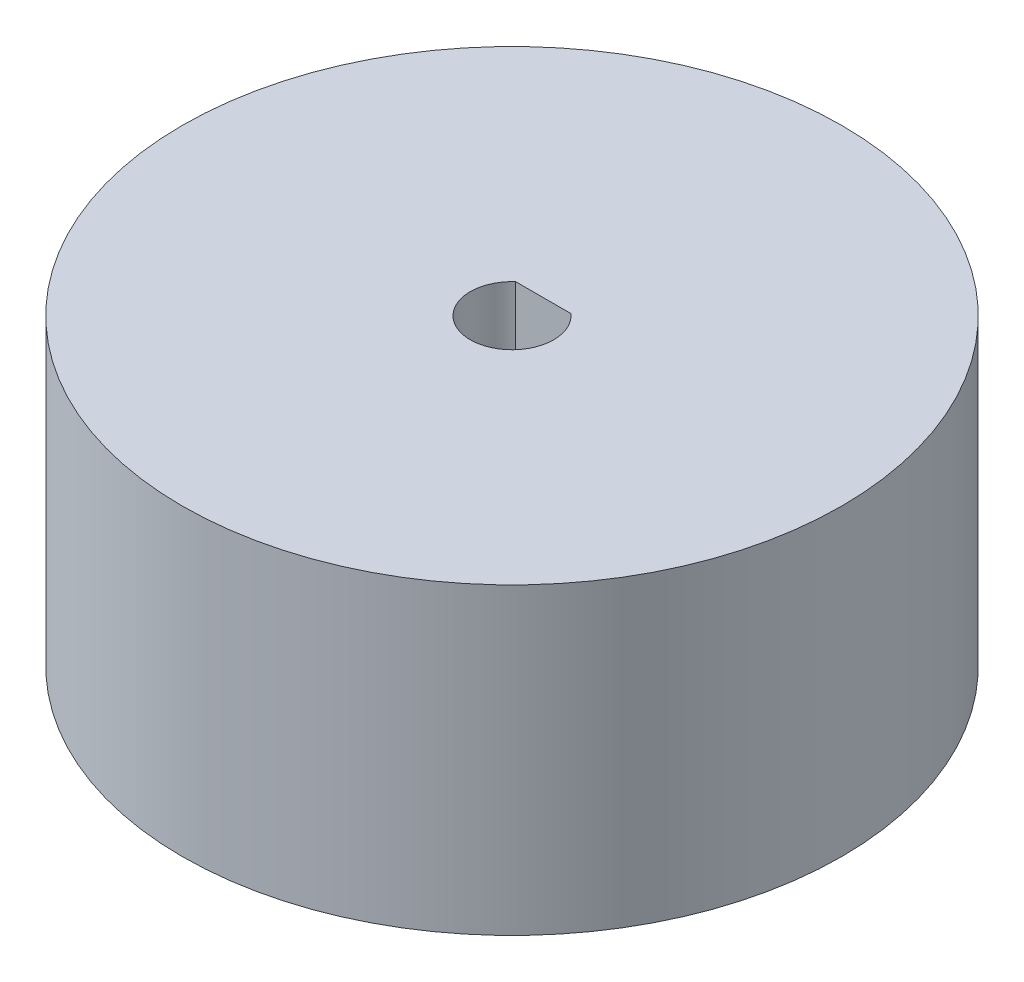
ISO-10303-21;
HEADER;
FILE_DESCRIPTION(('STEP AP214'),'2;1');
FILE_NAME('part.step','',(''),(''),'','','');
FILE_SCHEMA(('AUTOMOTIVE_DESIGN { 1 0 10303 214 1 1 1 1 }'));
ENDSEC;
DATA;
#1=APPLICATION_CONTEXT('core data for automotive mechanical design processes');
#2=APPLICATION_PROTOCOL_DEFINITION('international standard','automotive_design',2000,#1);
#3=PRODUCT_CONTEXT('',#1,'mechanical');
#4=PRODUCT('Part','Part','',(#3));
#5=PRODUCT_RELATED_PRODUCT_CATEGORY('part','',(#4));
#6=PRODUCT_DEFINITION_FORMATION('','',#4);
#7=PRODUCT_DEFINITION_CONTEXT('part definition',#1,'design');
#8=PRODUCT_DEFINITION('design','',#6,#7);
#9=PRODUCT_DEFINITION_SHAPE('','',#8);
#10=(LENGTH_UNIT() NAMED_UNIT(*) SI_UNIT(.MILLI.,.METRE.));
#11=(NAMED_UNIT(*) PLANE_ANGLE_UNIT() SI_UNIT($,.RADIAN.));
#12=(NAMED_UNIT(*) SI_UNIT($,.STERADIAN.) SOLID_ANGLE_UNIT());
#13=UNCERTAINTY_MEASURE_WITH_UNIT(LENGTH_MEASURE(1.E-05),#10,'distance_accuracy_value','');
#14=(GEOMETRIC_REPRESENTATION_CONTEXT(3) GLOBAL_UNCERTAINTY_ASSIGNED_CONTEXT((#13)) GLOBAL_UNIT_ASSIGNED_CONTEXT((#10,
#11,#12)) REPRESENTATION_CONTEXT('',''));
#15=CARTESIAN_POINT('',(0.,0.,0.));
#16=DIRECTION('',(0.,0.,1.));
#17=DIRECTION('',(1.,0.,0.));
#18=AXIS2_PLACEMENT_3D('',#15,#16,#17);
#19=CARTESIAN_POINT('',(0.,16.,0.));
#20=DIRECTION('',(0.,1.,0.));
#21=DIRECTION('',(0.,0.,1.));
#22=AXIS2_PLACEMENT_3D('',#19,#20,#21);
#23=PLANE('',#22);
#24=CARTESIAN_POINT('',(0.,16.,0.));
#25=DIRECTION('',(0.,1.,0.));
#26=DIRECTION('',(0.,0.,1.));
#27=AXIS2_PLACEMENT_3D('',#24,#25,#26);
#28=CIRCLE('',#27,17.375);
#29=CARTESIAN_POINT('',(0.,16.,17.375));
#30=VERTEX_POINT('',#29);
#31=EDGE_CURVE('E11',#30,#30,#28,.T.);
#32=ORIENTED_EDGE('',*,*,#31,.T.);
#33=EDGE_LOOP('',(#32));
#34=FACE_BOUND('',#33,.T.);
#35=DIRECTION('',(-1.,0.,0.));
#36=VECTOR('',#35,1.);
#37=CARTESIAN_POINT('',(-1.45516322108552,16.,-1.65));
#38=LINE('',#37,#36);
#39=CARTESIAN_POINT('',(1.45516322108552,16.,-1.65));
#40=VERTEX_POINT('',#39);
#41=CARTESIAN_POINT('',(-1.45516322108552,16.,-1.65));
#42=VERTEX_POINT('',#41);
#43=EDGE_CURVE('E88',#40,#42,#38,.T.);
#44=ORIENTED_EDGE('',*,*,#43,.F.);
#45=CARTESIAN_POINT('',(0.,16.,0.));
#46=DIRECTION('',(0.,1.,0.));
#47=DIRECTION('',(0.,0.,1.));
#48=AXIS2_PLACEMENT_3D('',#45,#46,#47);
#49=CIRCLE('',#48,2.2);
#50=EDGE_CURVE('E77',#42,#40,#49,.T.);
#51=ORIENTED_EDGE('',*,*,#50,.F.);
#52=EDGE_LOOP('',(#44,#51));
#53=FACE_BOUND('',#52,.T.);
#54=ADVANCED_FACE('F43',(#34,#53),#23,.T.);
#55=CARTESIAN_POINT('',(0.,0.,0.));
#56=DIRECTION('',(0.,1.,0.));
#57=DIRECTION('',(0.,0.,1.));
#58=AXIS2_PLACEMENT_3D('',#55,#56,#57);
#59=PLANE('',#58);
#60=CARTESIAN_POINT('',(0.,0.,0.));
#61=DIRECTION('',(0.,1.,0.));
#62=DIRECTION('',(0.,0.,1.));
#63=AXIS2_PLACEMENT_3D('',#60,#61,#62);
#64=CIRCLE('',#63,17.375);
#65=CARTESIAN_POINT('',(0.,0.,17.375));
#66=VERTEX_POINT('',#65);
#67=EDGE_CURVE('E47',#66,#66,#64,.T.);
#68=ORIENTED_EDGE('',*,*,#67,.F.);
#69=EDGE_LOOP('',(#68));
#70=FACE_BOUND('',#69,.T.);
#71=CARTESIAN_POINT('',(0.,0.,0.));
#72=DIRECTION('',(0.,1.,0.));
#73=DIRECTION('',(0.,0.,1.));
#74=AXIS2_PLACEMENT_3D('',#71,#72,#73);
#75=CIRCLE('',#74,2.2);
#76=CARTESIAN_POINT('',(-1.45516322108552,0.,-1.65));
#77=VERTEX_POINT('',#76);
#78=CARTESIAN_POINT('',(1.45516322108552,0.,-1.65));
#79=VERTEX_POINT('',#78);
#80=EDGE_CURVE('E66',#77,#79,#75,.T.);
#81=ORIENTED_EDGE('',*,*,#80,.T.);
#82=DIRECTION('',(-1.,0.,0.));
#83=VECTOR('',#82,1.);
#84=CARTESIAN_POINT('',(-1.45516322108552,0.,-1.65));
#85=LINE('',#84,#83);
#86=EDGE_CURVE('E72',#79,#77,#85,.T.);
#87=ORIENTED_EDGE('',*,*,#86,.T.);
#88=EDGE_LOOP('',(#81,#87));
#89=FACE_BOUND('',#88,.T.);
#90=ADVANCED_FACE('F84',(#70,#89),#59,.F.);
#91=CARTESIAN_POINT('',(0.,16.,0.));
#92=DIRECTION('',(0.,-1.,0.));
#93=DIRECTION('',(0.,0.,-1.));
#94=AXIS2_PLACEMENT_3D('',#91,#92,#93);
#95=CYLINDRICAL_SURFACE('',#94,17.375);
#96=ORIENTED_EDGE('',*,*,#31,.F.);
#97=EDGE_LOOP('',(#96));
#98=FACE_BOUND('',#97,.T.);
#99=ORIENTED_EDGE('',*,*,#67,.T.);
#100=EDGE_LOOP('',(#99));
#101=FACE_BOUND('',#100,.T.);
#102=ADVANCED_FACE('F45',(#98,#101),#95,.T.);
#103=CARTESIAN_POINT('',(0.,16.,0.));
#104=DIRECTION('',(0.,-1.,0.));
#105=DIRECTION('',(0.,0.,-1.));
#106=AXIS2_PLACEMENT_3D('',#103,#104,#105);
#107=CYLINDRICAL_SURFACE('',#106,2.2);
#108=ORIENTED_EDGE('',*,*,#80,.F.);
#109=DIRECTION('',(0.,-1.,0.));
#110=VECTOR('',#109,1.);
#111=CARTESIAN_POINT('',(-1.45516322108552,16.,-1.65));
#112=LINE('',#111,#110);
#113=EDGE_CURVE('E74',#42,#77,#112,.T.);
#114=ORIENTED_EDGE('',*,*,#113,.F.);
#115=ORIENTED_EDGE('',*,*,#50,.T.);
#116=DIRECTION('',(0.,-1.,0.));
#117=VECTOR('',#116,1.);
#118=CARTESIAN_POINT('',(1.45516322108552,16.,-1.65));
#119=LINE('',#118,#117);
#120=EDGE_CURVE('E59',#40,#79,#119,.T.);
#121=ORIENTED_EDGE('',*,*,#120,.T.);
#122=EDGE_LOOP('',(#108,#114,#115,#121));
#123=FACE_BOUND('',#122,.T.);
#124=ADVANCED_FACE('F79',(#123),#107,.F.);
#125=CARTESIAN_POINT('',(-1.45516322108552,16.,-1.65));
#126=DIRECTION('',(0.,0.,1.));
#127=DIRECTION('',(1.,0.,0.));
#128=AXIS2_PLACEMENT_3D('',#125,#126,#127);
#129=PLANE('',#128);
#130=ORIENTED_EDGE('',*,*,#86,.F.);
#131=ORIENTED_EDGE('',*,*,#120,.F.);
#132=ORIENTED_EDGE('',*,*,#43,.T.);
#133=ORIENTED_EDGE('',*,*,#113,.T.);
#134=EDGE_LOOP('',(#130,#131,#132,#133));
#135=FACE_BOUND('',#134,.T.);
#136=ADVANCED_FACE('F73',(#135),#129,.T.);
#137=CLOSED_SHELL('',(#54,#90,#102,#124,#136));
#138=MANIFOLD_SOLID_BREP('B2',#137);
#139=ADVANCED_BREP_SHAPE_REPRESENTATION('',(#18,#138),#14);
#140=SHAPE_DEFINITION_REPRESENTATION(#9,#139);
ENDSEC;
END-ISO-10303-21;
